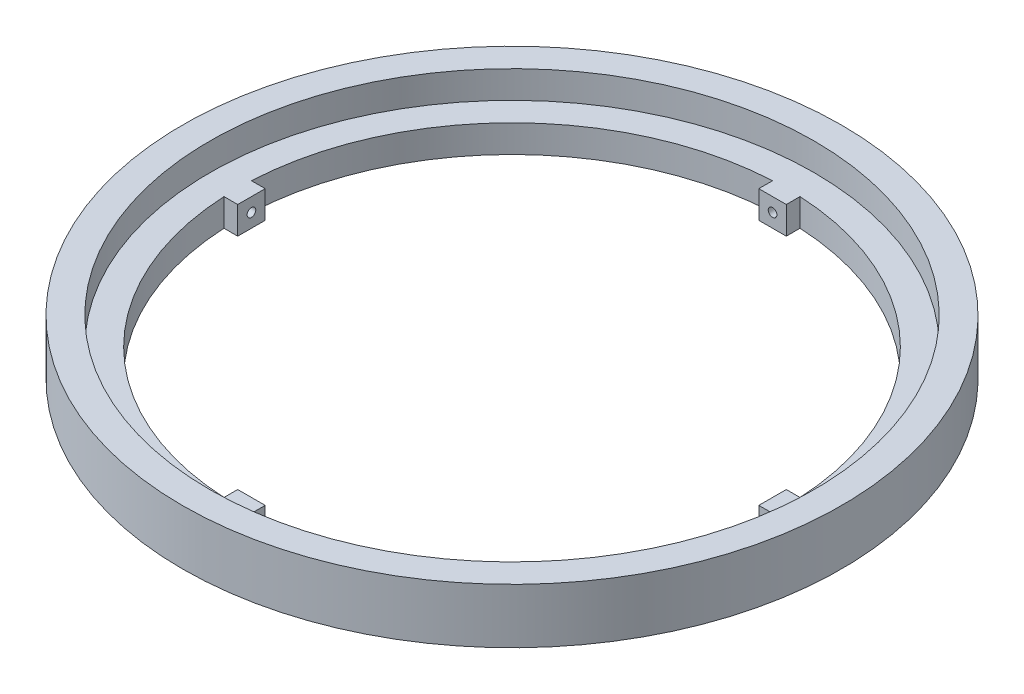
ISO-10303-21;
HEADER;
FILE_DESCRIPTION(('STEP AP214'),'2;1');
FILE_NAME('part.step','',(''),(''),'','','');
FILE_SCHEMA(('AUTOMOTIVE_DESIGN { 1 0 10303 214 1 1 1 1 }'));
ENDSEC;
DATA;
#1=APPLICATION_CONTEXT('core data for automotive mechanical design processes');
#2=APPLICATION_PROTOCOL_DEFINITION('international standard','automotive_design',2000,#1);
#3=PRODUCT_CONTEXT('',#1,'mechanical');
#4=PRODUCT('Part','Part','',(#3));
#5=PRODUCT_RELATED_PRODUCT_CATEGORY('part','',(#4));
#6=PRODUCT_DEFINITION_FORMATION('','',#4);
#7=PRODUCT_DEFINITION_CONTEXT('part definition',#1,'design');
#8=PRODUCT_DEFINITION('design','',#6,#7);
#9=PRODUCT_DEFINITION_SHAPE('','',#8);
#10=(LENGTH_UNIT() NAMED_UNIT(*) SI_UNIT(.MILLI.,.METRE.));
#11=(NAMED_UNIT(*) PLANE_ANGLE_UNIT() SI_UNIT($,.RADIAN.));
#12=(NAMED_UNIT(*) SI_UNIT($,.STERADIAN.) SOLID_ANGLE_UNIT());
#13=UNCERTAINTY_MEASURE_WITH_UNIT(LENGTH_MEASURE(1.E-05),#10,'distance_accuracy_value','');
#14=(GEOMETRIC_REPRESENTATION_CONTEXT(3) GLOBAL_UNCERTAINTY_ASSIGNED_CONTEXT((#13)) GLOBAL_UNIT_ASSIGNED_CONTEXT((#10,
#11,#12)) REPRESENTATION_CONTEXT('',''));
#15=CARTESIAN_POINT('',(0.,0.,0.));
#16=DIRECTION('',(0.,0.,1.));
#17=DIRECTION('',(1.,0.,0.));
#18=AXIS2_PLACEMENT_3D('',#15,#16,#17);
#19=CARTESIAN_POINT('',(0.,12.7,0.));
#20=DIRECTION('',(0.,-1.,0.));
#21=DIRECTION('',(0.,0.,-1.));
#22=AXIS2_PLACEMENT_3D('',#19,#20,#21);
#23=CYLINDRICAL_SURFACE('',#22,127.);
#24=CARTESIAN_POINT('',(0.,12.7,0.));
#25=DIRECTION('',(0.,1.,0.));
#26=DIRECTION('',(0.,0.,1.));
#27=AXIS2_PLACEMENT_3D('',#24,#25,#26);
#28=CIRCLE('',#27,127.);
#29=CARTESIAN_POINT('',(126.841150657032,12.7,-6.34999999999995));
#30=VERTEX_POINT('',#29);
#31=CARTESIAN_POINT('',(6.35,12.7,-126.841150657032));
#32=VERTEX_POINT('',#31);
#33=EDGE_CURVE('E328',#30,#32,#28,.T.);
#34=ORIENTED_EDGE('',*,*,#33,.T.);
#35=DIRECTION('',(0.,-1.,0.));
#36=VECTOR('',#35,1.);
#37=CARTESIAN_POINT('',(6.35,12.7,-126.841150657032));
#38=LINE('',#37,#36);
#39=CARTESIAN_POINT('',(6.35,0.,-126.841150657032));
#40=VERTEX_POINT('',#39);
#41=EDGE_CURVE('E58',#32,#40,#38,.T.);
#42=ORIENTED_EDGE('',*,*,#41,.T.);
#43=CARTESIAN_POINT('',(0.,0.,0.));
#44=DIRECTION('',(0.,1.,0.));
#45=DIRECTION('',(0.,0.,1.));
#46=AXIS2_PLACEMENT_3D('',#43,#44,#45);
#47=CIRCLE('',#46,127.);
#48=CARTESIAN_POINT('',(126.841150657032,0.,-6.34999999999995));
#49=VERTEX_POINT('',#48);
#50=EDGE_CURVE('E315',#49,#40,#47,.T.);
#51=ORIENTED_EDGE('',*,*,#50,.F.);
#52=DIRECTION('',(0.,-1.,0.));
#53=VECTOR('',#52,1.);
#54=CARTESIAN_POINT('',(126.841150657032,12.7,-6.34999999999995));
#55=LINE('',#54,#53);
#56=EDGE_CURVE('E214',#30,#49,#55,.T.);
#57=ORIENTED_EDGE('',*,*,#56,.F.);
#58=EDGE_LOOP('',(#34,#42,#51,#57));
#59=FACE_BOUND('',#58,.T.);
#60=ADVANCED_FACE('F35',(#59),#23,.F.);
#61=CARTESIAN_POINT('',(6.34999999999996,12.7,126.841150657032));
#62=VERTEX_POINT('',#61);
#63=CARTESIAN_POINT('',(126.841150657032,12.7,6.35000000000004));
#64=VERTEX_POINT('',#63);
#65=EDGE_CURVE('E275',#62,#64,#28,.T.);
#66=ORIENTED_EDGE('',*,*,#65,.T.);
#67=DIRECTION('',(0.,-1.,0.));
#68=VECTOR('',#67,1.);
#69=CARTESIAN_POINT('',(126.841150657032,12.7,6.35000000000005));
#70=LINE('',#69,#68);
#71=CARTESIAN_POINT('',(126.841150657032,0.,6.35000000000004));
#72=VERTEX_POINT('',#71);
#73=EDGE_CURVE('E212',#64,#72,#70,.T.);
#74=ORIENTED_EDGE('',*,*,#73,.T.);
#75=CARTESIAN_POINT('',(6.34999999999996,0.,126.841150657032));
#76=VERTEX_POINT('',#75);
#77=EDGE_CURVE('E279',#76,#72,#47,.T.);
#78=ORIENTED_EDGE('',*,*,#77,.F.);
#79=DIRECTION('',(0.,-1.,0.));
#80=VECTOR('',#79,1.);
#81=CARTESIAN_POINT('',(6.34999999999996,12.7,126.841150657032));
#82=LINE('',#81,#80);
#83=EDGE_CURVE('E242',#62,#76,#82,.T.);
#84=ORIENTED_EDGE('',*,*,#83,.F.);
#85=EDGE_LOOP('',(#66,#74,#78,#84));
#86=FACE_BOUND('',#85,.T.);
#87=ADVANCED_FACE('F313',(#86),#23,.F.);
#88=CARTESIAN_POINT('',(-126.841150657032,12.7,6.35));
#89=VERTEX_POINT('',#88);
#90=CARTESIAN_POINT('',(-6.35000000000003,12.7,126.841150657032));
#91=VERTEX_POINT('',#90);
#92=EDGE_CURVE('E272',#89,#91,#28,.T.);
#93=ORIENTED_EDGE('',*,*,#92,.T.);
#94=DIRECTION('',(0.,-1.,0.));
#95=VECTOR('',#94,1.);
#96=CARTESIAN_POINT('',(-6.35000000000004,12.7,126.841150657032));
#97=LINE('',#96,#95);
#98=CARTESIAN_POINT('',(-6.35000000000003,0.,126.841150657032));
#99=VERTEX_POINT('',#98);
#100=EDGE_CURVE('E240',#91,#99,#97,.T.);
#101=ORIENTED_EDGE('',*,*,#100,.T.);
#102=CARTESIAN_POINT('',(-126.841150657032,0.,6.35));
#103=VERTEX_POINT('',#102);
#104=EDGE_CURVE('E276',#103,#99,#47,.T.);
#105=ORIENTED_EDGE('',*,*,#104,.F.);
#106=DIRECTION('',(0.,-1.,0.));
#107=VECTOR('',#106,1.);
#108=CARTESIAN_POINT('',(-126.841150657032,12.7,6.35));
#109=LINE('',#108,#107);
#110=EDGE_CURVE('E268',#89,#103,#109,.T.);
#111=ORIENTED_EDGE('',*,*,#110,.F.);
#112=EDGE_LOOP('',(#93,#101,#105,#111));
#113=FACE_BOUND('',#112,.T.);
#114=ADVANCED_FACE('F327',(#113),#23,.F.);
#115=DIRECTION('',(0.,-1.,0.));
#116=VECTOR('',#115,1.);
#117=CARTESIAN_POINT('',(-6.35,12.7,-126.841150657032));
#118=LINE('',#117,#116);
#119=CARTESIAN_POINT('',(-6.35,12.7,-126.841150657032));
#120=VERTEX_POINT('',#119);
#121=CARTESIAN_POINT('',(-6.35,0.,-126.841150657032));
#122=VERTEX_POINT('',#121);
#123=EDGE_CURVE('E159',#120,#122,#118,.T.);
#124=ORIENTED_EDGE('',*,*,#123,.F.);
#125=CARTESIAN_POINT('',(-126.841150657032,12.7,-6.35));
#126=VERTEX_POINT('',#125);
#127=EDGE_CURVE('E175',#120,#126,#28,.T.);
#128=ORIENTED_EDGE('',*,*,#127,.T.);
#129=DIRECTION('',(0.,-1.,0.));
#130=VECTOR('',#129,1.);
#131=CARTESIAN_POINT('',(-126.841150657032,12.7,-6.35));
#132=LINE('',#131,#130);
#133=CARTESIAN_POINT('',(-126.841150657032,0.,-6.35));
#134=VERTEX_POINT('',#133);
#135=EDGE_CURVE('E266',#126,#134,#132,.T.);
#136=ORIENTED_EDGE('',*,*,#135,.T.);
#137=EDGE_CURVE('E50',#122,#134,#47,.T.);
#138=ORIENTED_EDGE('',*,*,#137,.F.);
#139=EDGE_LOOP('',(#124,#128,#136,#138));
#140=FACE_BOUND('',#139,.T.);
#141=ADVANCED_FACE('F317',(#140),#23,.F.);
#142=CARTESIAN_POINT('',(0.,25.4,0.));
#143=DIRECTION('',(0.,-1.,0.));
#144=DIRECTION('',(0.,0.,-1.));
#145=AXIS2_PLACEMENT_3D('',#142,#143,#144);
#146=CYLINDRICAL_SURFACE('',#145,139.7);
#147=CARTESIAN_POINT('',(0.,12.7,0.));
#148=DIRECTION('',(0.,1.,0.));
#149=DIRECTION('',(0.,0.,1.));
#150=AXIS2_PLACEMENT_3D('',#147,#148,#149);
#151=CIRCLE('',#150,139.7);
#152=CARTESIAN_POINT('',(0.,12.7,139.7));
#153=VERTEX_POINT('',#152);
#154=EDGE_CURVE('E11',#153,#153,#151,.T.);
#155=ORIENTED_EDGE('',*,*,#154,.F.);
#156=EDGE_LOOP('',(#155));
#157=FACE_BOUND('',#156,.T.);
#158=CARTESIAN_POINT('',(0.,25.4,0.));
#159=DIRECTION('',(0.,1.,0.));
#160=DIRECTION('',(0.,0.,1.));
#161=AXIS2_PLACEMENT_3D('',#158,#159,#160);
#162=CIRCLE('',#161,139.7);
#163=CARTESIAN_POINT('',(0.,25.4,139.7));
#164=VERTEX_POINT('',#163);
#165=EDGE_CURVE('E280',#164,#164,#162,.T.);
#166=ORIENTED_EDGE('',*,*,#165,.T.);
#167=EDGE_LOOP('',(#166));
#168=FACE_BOUND('',#167,.T.);
#169=ADVANCED_FACE('F37',(#157,#168),#146,.F.);
#170=CARTESIAN_POINT('',(0.,25.4,0.));
#171=DIRECTION('',(0.,-1.,0.));
#172=DIRECTION('',(0.,0.,-1.));
#173=AXIS2_PLACEMENT_3D('',#170,#171,#172);
#174=CYLINDRICAL_SURFACE('',#173,152.4);
#175=CARTESIAN_POINT('',(0.,25.4,0.));
#176=DIRECTION('',(0.,1.,0.));
#177=DIRECTION('',(0.,0.,1.));
#178=AXIS2_PLACEMENT_3D('',#175,#176,#177);
#179=CIRCLE('',#178,152.4);
#180=CARTESIAN_POINT('',(0.,25.4,152.4));
#181=VERTEX_POINT('',#180);
#182=EDGE_CURVE('E43',#181,#181,#179,.T.);
#183=ORIENTED_EDGE('',*,*,#182,.F.);
#184=EDGE_LOOP('',(#183));
#185=FACE_BOUND('',#184,.T.);
#186=CARTESIAN_POINT('',(0.,0.,0.));
#187=DIRECTION('',(0.,1.,0.));
#188=DIRECTION('',(0.,0.,1.));
#189=AXIS2_PLACEMENT_3D('',#186,#187,#188);
#190=CIRCLE('',#189,152.4);
#191=CARTESIAN_POINT('',(0.,0.,152.4));
#192=VERTEX_POINT('',#191);
#193=EDGE_CURVE('E274',#192,#192,#190,.T.);
#194=ORIENTED_EDGE('',*,*,#193,.T.);
#195=EDGE_LOOP('',(#194));
#196=FACE_BOUND('',#195,.T.);
#197=ADVANCED_FACE('F287',(#185,#196),#174,.T.);
#198=CARTESIAN_POINT('',(0.,25.4,0.));
#199=DIRECTION('',(0.,1.,0.));
#200=DIRECTION('',(0.,0.,1.));
#201=AXIS2_PLACEMENT_3D('',#198,#199,#200);
#202=PLANE('',#201);
#203=ORIENTED_EDGE('',*,*,#165,.F.);
#204=EDGE_LOOP('',(#203));
#205=FACE_BOUND('',#204,.T.);
#206=ORIENTED_EDGE('',*,*,#182,.T.);
#207=EDGE_LOOP('',(#206));
#208=FACE_BOUND('',#207,.T.);
#209=ADVANCED_FACE('F292',(#205,#208),#202,.T.);
#210=CARTESIAN_POINT('',(0.,0.,0.));
#211=DIRECTION('',(0.,1.,0.));
#212=DIRECTION('',(0.,0.,1.));
#213=AXIS2_PLACEMENT_3D('',#210,#211,#212);
#214=PLANE('',#213);
#215=ORIENTED_EDGE('',*,*,#193,.F.);
#216=EDGE_LOOP('',(#215));
#217=FACE_BOUND('',#216,.T.);
#218=ORIENTED_EDGE('',*,*,#104,.T.);
#219=DIRECTION('',(0.,0.,1.));
#220=VECTOR('',#219,1.);
#221=CARTESIAN_POINT('',(-6.35,0.,0.));
#222=LINE('',#221,#220);
#223=CARTESIAN_POINT('',(-6.35000000000003,0.,120.491150657032));
#224=VERTEX_POINT('',#223);
#225=EDGE_CURVE('E222',#224,#99,#222,.T.);
#226=ORIENTED_EDGE('',*,*,#225,.F.);
#227=DIRECTION('',(-1.,0.,0.));
#228=VECTOR('',#227,1.);
#229=CARTESIAN_POINT('',(0.,0.,120.491150657032));
#230=LINE('',#229,#228);
#231=CARTESIAN_POINT('',(6.34999999999997,0.,120.491150657032));
#232=VERTEX_POINT('',#231);
#233=EDGE_CURVE('E211',#232,#224,#230,.T.);
#234=ORIENTED_EDGE('',*,*,#233,.F.);
#235=DIRECTION('',(0.,0.,1.));
#236=VECTOR('',#235,1.);
#237=CARTESIAN_POINT('',(6.35,0.,0.));
#238=LINE('',#237,#236);
#239=EDGE_CURVE('E231',#232,#76,#238,.T.);
#240=ORIENTED_EDGE('',*,*,#239,.T.);
#241=ORIENTED_EDGE('',*,*,#77,.T.);
#242=DIRECTION('',(1.,0.,0.));
#243=VECTOR('',#242,1.);
#244=CARTESIAN_POINT('',(0.,0.,6.35000000000005));
#245=LINE('',#244,#243);
#246=CARTESIAN_POINT('',(120.491150657032,0.,6.35000000000005));
#247=VERTEX_POINT('',#246);
#248=EDGE_CURVE('E194',#247,#72,#245,.T.);
#249=ORIENTED_EDGE('',*,*,#248,.F.);
#250=DIRECTION('',(0.,0.,1.));
#251=VECTOR('',#250,1.);
#252=CARTESIAN_POINT('',(120.491150657032,0.,0.));
#253=LINE('',#252,#251);
#254=CARTESIAN_POINT('',(120.491150657032,0.,-6.34999999999995));
#255=VERTEX_POINT('',#254);
#256=EDGE_CURVE('E187',#255,#247,#253,.T.);
#257=ORIENTED_EDGE('',*,*,#256,.F.);
#258=DIRECTION('',(1.,0.,0.));
#259=VECTOR('',#258,1.);
#260=CARTESIAN_POINT('',(0.,0.,-6.34999999999995));
#261=LINE('',#260,#259);
#262=EDGE_CURVE('E203',#255,#49,#261,.T.);
#263=ORIENTED_EDGE('',*,*,#262,.T.);
#264=ORIENTED_EDGE('',*,*,#50,.T.);
#265=DIRECTION('',(0.,0.,-1.));
#266=VECTOR('',#265,1.);
#267=CARTESIAN_POINT('',(6.35,0.,0.));
#268=LINE('',#267,#266);
#269=CARTESIAN_POINT('',(6.35,0.,-120.491150657032));
#270=VERTEX_POINT('',#269);
#271=EDGE_CURVE('E170',#270,#40,#268,.T.);
#272=ORIENTED_EDGE('',*,*,#271,.F.);
#273=DIRECTION('',(1.,0.,0.));
#274=VECTOR('',#273,1.);
#275=CARTESIAN_POINT('',(0.,0.,-120.491150657032));
#276=LINE('',#275,#274);
#277=CARTESIAN_POINT('',(-6.35,0.,-120.491150657032));
#278=VERTEX_POINT('',#277);
#279=EDGE_CURVE('E180',#278,#270,#276,.T.);
#280=ORIENTED_EDGE('',*,*,#279,.F.);
#281=DIRECTION('',(0.,0.,-1.));
#282=VECTOR('',#281,1.);
#283=CARTESIAN_POINT('',(-6.35,0.,0.));
#284=LINE('',#283,#282);
#285=EDGE_CURVE('E155',#278,#122,#284,.T.);
#286=ORIENTED_EDGE('',*,*,#285,.T.);
#287=ORIENTED_EDGE('',*,*,#137,.T.);
#288=DIRECTION('',(-1.,0.,0.));
#289=VECTOR('',#288,1.);
#290=CARTESIAN_POINT('',(0.,0.,-6.35));
#291=LINE('',#290,#289);
#292=CARTESIAN_POINT('',(-120.491150657032,0.,-6.35));
#293=VERTEX_POINT('',#292);
#294=EDGE_CURVE('E250',#293,#134,#291,.T.);
#295=ORIENTED_EDGE('',*,*,#294,.F.);
#296=DIRECTION('',(0.,0.,-1.));
#297=VECTOR('',#296,1.);
#298=CARTESIAN_POINT('',(-120.491150657032,0.,0.));
#299=LINE('',#298,#297);
#300=CARTESIAN_POINT('',(-120.491150657032,0.,6.35));
#301=VERTEX_POINT('',#300);
#302=EDGE_CURVE('E239',#301,#293,#299,.T.);
#303=ORIENTED_EDGE('',*,*,#302,.F.);
#304=DIRECTION('',(-1.,0.,0.));
#305=VECTOR('',#304,1.);
#306=CARTESIAN_POINT('',(0.,0.,6.35));
#307=LINE('',#306,#305);
#308=EDGE_CURVE('E258',#301,#103,#307,.T.);
#309=ORIENTED_EDGE('',*,*,#308,.T.);
#310=EDGE_LOOP('',(#218,#226,#234,#240,#241,#249,#257,#263,#264,#272,#280,#286,#287,#295,#303,#309));
#311=FACE_BOUND('',#310,.T.);
#312=ADVANCED_FACE('F289',(#217,#311),#214,.F.);
#313=CARTESIAN_POINT('',(0.,12.7,0.));
#314=DIRECTION('',(0.,1.,0.));
#315=DIRECTION('',(0.,0.,1.));
#316=AXIS2_PLACEMENT_3D('',#313,#314,#315);
#317=PLANE('',#316);
#318=ORIENTED_EDGE('',*,*,#92,.F.);
#319=DIRECTION('',(-1.,0.,0.));
#320=VECTOR('',#319,1.);
#321=CARTESIAN_POINT('',(0.,12.7,6.35));
#322=LINE('',#321,#320);
#323=CARTESIAN_POINT('',(-120.491150657032,12.7,6.35));
#324=VERTEX_POINT('',#323);
#325=EDGE_CURVE('E249',#324,#89,#322,.T.);
#326=ORIENTED_EDGE('',*,*,#325,.F.);
#327=DIRECTION('',(0.,0.,-1.));
#328=VECTOR('',#327,1.);
#329=CARTESIAN_POINT('',(-120.491150657032,12.7,0.));
#330=LINE('',#329,#328);
#331=CARTESIAN_POINT('',(-120.491150657032,12.7,-6.35));
#332=VERTEX_POINT('',#331);
#333=EDGE_CURVE('E246',#324,#332,#330,.T.);
#334=ORIENTED_EDGE('',*,*,#333,.T.);
#335=DIRECTION('',(-1.,0.,0.));
#336=VECTOR('',#335,1.);
#337=CARTESIAN_POINT('',(0.,12.7,-6.35));
#338=LINE('',#337,#336);
#339=EDGE_CURVE('E253',#332,#126,#338,.T.);
#340=ORIENTED_EDGE('',*,*,#339,.T.);
#341=ORIENTED_EDGE('',*,*,#127,.F.);
#342=DIRECTION('',(0.,0.,-1.));
#343=VECTOR('',#342,1.);
#344=CARTESIAN_POINT('',(-6.35,12.7,0.));
#345=LINE('',#344,#343);
#346=CARTESIAN_POINT('',(-6.35,12.7,-120.491150657032));
#347=VERTEX_POINT('',#346);
#348=EDGE_CURVE('E153',#347,#120,#345,.T.);
#349=ORIENTED_EDGE('',*,*,#348,.F.);
#350=DIRECTION('',(1.,0.,0.));
#351=VECTOR('',#350,1.);
#352=CARTESIAN_POINT('',(0.,12.7,-120.491150657032));
#353=LINE('',#352,#351);
#354=CARTESIAN_POINT('',(6.35,12.7,-120.491150657032));
#355=VERTEX_POINT('',#354);
#356=EDGE_CURVE('E164',#347,#355,#353,.T.);
#357=ORIENTED_EDGE('',*,*,#356,.T.);
#358=DIRECTION('',(0.,0.,-1.));
#359=VECTOR('',#358,1.);
#360=CARTESIAN_POINT('',(6.35,12.7,0.));
#361=LINE('',#360,#359);
#362=EDGE_CURVE('E160',#355,#32,#361,.T.);
#363=ORIENTED_EDGE('',*,*,#362,.T.);
#364=ORIENTED_EDGE('',*,*,#33,.F.);
#365=DIRECTION('',(1.,0.,0.));
#366=VECTOR('',#365,1.);
#367=CARTESIAN_POINT('',(0.,12.7,-6.34999999999995));
#368=LINE('',#367,#366);
#369=CARTESIAN_POINT('',(120.491150657032,12.7,-6.34999999999995));
#370=VERTEX_POINT('',#369);
#371=EDGE_CURVE('E193',#370,#30,#368,.T.);
#372=ORIENTED_EDGE('',*,*,#371,.F.);
#373=DIRECTION('',(0.,0.,1.));
#374=VECTOR('',#373,1.);
#375=CARTESIAN_POINT('',(120.491150657032,12.7,0.));
#376=LINE('',#375,#374);
#377=CARTESIAN_POINT('',(120.491150657032,12.7,6.35000000000005));
#378=VERTEX_POINT('',#377);
#379=EDGE_CURVE('E190',#370,#378,#376,.T.);
#380=ORIENTED_EDGE('',*,*,#379,.T.);
#381=DIRECTION('',(1.,0.,0.));
#382=VECTOR('',#381,1.);
#383=CARTESIAN_POINT('',(0.,12.7,6.35000000000005));
#384=LINE('',#383,#382);
#385=EDGE_CURVE('E197',#378,#64,#384,.T.);
#386=ORIENTED_EDGE('',*,*,#385,.T.);
#387=ORIENTED_EDGE('',*,*,#65,.F.);
#388=DIRECTION('',(0.,0.,1.));
#389=VECTOR('',#388,1.);
#390=CARTESIAN_POINT('',(6.35,12.7,0.));
#391=LINE('',#390,#389);
#392=CARTESIAN_POINT('',(6.34999999999997,12.7,120.491150657032));
#393=VERTEX_POINT('',#392);
#394=EDGE_CURVE('E221',#393,#62,#391,.T.);
#395=ORIENTED_EDGE('',*,*,#394,.F.);
#396=DIRECTION('',(-1.,0.,0.));
#397=VECTOR('',#396,1.);
#398=CARTESIAN_POINT('',(0.,12.7,120.491150657032));
#399=LINE('',#398,#397);
#400=CARTESIAN_POINT('',(-6.35000000000003,12.7,120.491150657032));
#401=VERTEX_POINT('',#400);
#402=EDGE_CURVE('E218',#393,#401,#399,.T.);
#403=ORIENTED_EDGE('',*,*,#402,.T.);
#404=DIRECTION('',(0.,0.,1.));
#405=VECTOR('',#404,1.);
#406=CARTESIAN_POINT('',(-6.35,12.7,0.));
#407=LINE('',#406,#405);
#408=EDGE_CURVE('E225',#401,#91,#407,.T.);
#409=ORIENTED_EDGE('',*,*,#408,.T.);
#410=EDGE_LOOP('',(#318,#326,#334,#340,#341,#349,#357,#363,#364,#372,#380,#386,#387,#395,#403,#409));
#411=FACE_BOUND('',#410,.T.);
#412=ORIENTED_EDGE('',*,*,#154,.T.);
#413=EDGE_LOOP('',(#412));
#414=FACE_BOUND('',#413,.T.);
#415=ADVANCED_FACE('F172',(#411,#414),#317,.T.);
#416=CARTESIAN_POINT('',(-120.491150657032,12.7,0.));
#417=DIRECTION('',(-1.,0.,0.));
#418=DIRECTION('',(0.,0.,1.));
#419=AXIS2_PLACEMENT_3D('',#416,#417,#418);
#420=PLANE('',#419);
#421=CARTESIAN_POINT('',(-120.491150657032,6.35,0.));
#422=DIRECTION('',(1.,0.,0.));
#423=DIRECTION('',(0.,0.,-1.));
#424=AXIS2_PLACEMENT_3D('',#421,#422,#423);
#425=CIRCLE('',#424,2.);
#426=CARTESIAN_POINT('',(-120.491150657032,6.35,-2.));
#427=VERTEX_POINT('',#426);
#428=EDGE_CURVE('E557',#427,#427,#425,.T.);
#429=ORIENTED_EDGE('',*,*,#428,.F.);
#430=EDGE_LOOP('',(#429));
#431=FACE_BOUND('',#430,.T.);
#432=ORIENTED_EDGE('',*,*,#302,.T.);
#433=DIRECTION('',(0.,-1.,0.));
#434=VECTOR('',#433,1.);
#435=CARTESIAN_POINT('',(-120.491150657032,12.7,-6.35));
#436=LINE('',#435,#434);
#437=EDGE_CURVE('E263',#332,#293,#436,.T.);
#438=ORIENTED_EDGE('',*,*,#437,.F.);
#439=ORIENTED_EDGE('',*,*,#333,.F.);
#440=DIRECTION('',(0.,-1.,0.));
#441=VECTOR('',#440,1.);
#442=CARTESIAN_POINT('',(-120.491150657032,12.7,6.35));
#443=LINE('',#442,#441);
#444=EDGE_CURVE('E255',#324,#301,#443,.T.);
#445=ORIENTED_EDGE('',*,*,#444,.T.);
#446=EDGE_LOOP('',(#432,#438,#439,#445));
#447=FACE_BOUND('',#446,.T.);
#448=ADVANCED_FACE('F323',(#431,#447),#420,.F.);
#449=CARTESIAN_POINT('',(0.,12.7,-6.35));
#450=DIRECTION('',(0.,0.,1.));
#451=DIRECTION('',(1.,0.,0.));
#452=AXIS2_PLACEMENT_3D('',#449,#450,#451);
#453=PLANE('',#452);
#454=ORIENTED_EDGE('',*,*,#294,.T.);
#455=ORIENTED_EDGE('',*,*,#135,.F.);
#456=ORIENTED_EDGE('',*,*,#339,.F.);
#457=ORIENTED_EDGE('',*,*,#437,.T.);
#458=EDGE_LOOP('',(#454,#455,#456,#457));
#459=FACE_BOUND('',#458,.T.);
#460=ADVANCED_FACE('F319',(#459),#453,.F.);
#461=CARTESIAN_POINT('',(0.,12.7,6.35));
#462=DIRECTION('',(0.,0.,1.));
#463=DIRECTION('',(1.,0.,0.));
#464=AXIS2_PLACEMENT_3D('',#461,#462,#463);
#465=PLANE('',#464);
#466=ORIENTED_EDGE('',*,*,#308,.F.);
#467=ORIENTED_EDGE('',*,*,#444,.F.);
#468=ORIENTED_EDGE('',*,*,#325,.T.);
#469=ORIENTED_EDGE('',*,*,#110,.T.);
#470=EDGE_LOOP('',(#466,#467,#468,#469));
#471=FACE_BOUND('',#470,.T.);
#472=ADVANCED_FACE('F325',(#471),#465,.T.);
#473=CARTESIAN_POINT('',(0.,12.7,120.491150657032));
#474=DIRECTION('',(0.,0.,1.));
#475=DIRECTION('',(1.,0.,0.));
#476=AXIS2_PLACEMENT_3D('',#473,#474,#475);
#477=PLANE('',#476);
#478=CARTESIAN_POINT('',(4.17223157062812E-13,6.35,120.491150657032));
#479=DIRECTION('',(0.,0.,-1.));
#480=DIRECTION('',(-1.,0.,0.));
#481=AXIS2_PLACEMENT_3D('',#478,#479,#480);
#482=CIRCLE('',#481,2.);
#483=CARTESIAN_POINT('',(-1.99999999999958,6.35,120.491150657032));
#484=VERTEX_POINT('',#483);
#485=EDGE_CURVE('E560',#484,#484,#482,.T.);
#486=ORIENTED_EDGE('',*,*,#485,.F.);
#487=EDGE_LOOP('',(#486));
#488=FACE_BOUND('',#487,.T.);
#489=ORIENTED_EDGE('',*,*,#233,.T.);
#490=DIRECTION('',(0.,-1.,0.));
#491=VECTOR('',#490,1.);
#492=CARTESIAN_POINT('',(-6.35000000000003,12.7,120.491150657032));
#493=LINE('',#492,#491);
#494=EDGE_CURVE('E236',#401,#224,#493,.T.);
#495=ORIENTED_EDGE('',*,*,#494,.F.);
#496=ORIENTED_EDGE('',*,*,#402,.F.);
#497=DIRECTION('',(0.,-1.,0.));
#498=VECTOR('',#497,1.);
#499=CARTESIAN_POINT('',(6.34999999999997,12.7,120.491150657032));
#500=LINE('',#499,#498);
#501=EDGE_CURVE('E228',#393,#232,#500,.T.);
#502=ORIENTED_EDGE('',*,*,#501,.T.);
#503=EDGE_LOOP('',(#489,#495,#496,#502));
#504=FACE_BOUND('',#503,.T.);
#505=ADVANCED_FACE('F305',(#488,#504),#477,.F.);
#506=CARTESIAN_POINT('',(-6.35,12.7,0.));
#507=DIRECTION('',(1.,0.,0.));
#508=DIRECTION('',(0.,0.,-1.));
#509=AXIS2_PLACEMENT_3D('',#506,#507,#508);
#510=PLANE('',#509);
#511=ORIENTED_EDGE('',*,*,#225,.T.);
#512=ORIENTED_EDGE('',*,*,#100,.F.);
#513=ORIENTED_EDGE('',*,*,#408,.F.);
#514=ORIENTED_EDGE('',*,*,#494,.T.);
#515=EDGE_LOOP('',(#511,#512,#513,#514));
#516=FACE_BOUND('',#515,.T.);
#517=ADVANCED_FACE('F301',(#516),#510,.F.);
#518=CARTESIAN_POINT('',(6.35,12.7,0.));
#519=DIRECTION('',(1.,0.,0.));
#520=DIRECTION('',(0.,0.,-1.));
#521=AXIS2_PLACEMENT_3D('',#518,#519,#520);
#522=PLANE('',#521);
#523=ORIENTED_EDGE('',*,*,#239,.F.);
#524=ORIENTED_EDGE('',*,*,#501,.F.);
#525=ORIENTED_EDGE('',*,*,#394,.T.);
#526=ORIENTED_EDGE('',*,*,#83,.T.);
#527=EDGE_LOOP('',(#523,#524,#525,#526));
#528=FACE_BOUND('',#527,.T.);
#529=ADVANCED_FACE('F309',(#528),#522,.T.);
#530=CARTESIAN_POINT('',(120.491150657032,12.7,0.));
#531=DIRECTION('',(1.,0.,0.));
#532=DIRECTION('',(0.,0.,-1.));
#533=AXIS2_PLACEMENT_3D('',#530,#531,#532);
#534=PLANE('',#533);
#535=CARTESIAN_POINT('',(120.491150657032,6.35,0.));
#536=DIRECTION('',(-1.,0.,0.));
#537=DIRECTION('',(0.,0.,1.));
#538=AXIS2_PLACEMENT_3D('',#535,#536,#537);
#539=CIRCLE('',#538,2.);
#540=CARTESIAN_POINT('',(120.491150657032,6.35,2.));
#541=VERTEX_POINT('',#540);
#542=EDGE_CURVE('E569',#541,#541,#539,.T.);
#543=ORIENTED_EDGE('',*,*,#542,.F.);
#544=EDGE_LOOP('',(#543));
#545=FACE_BOUND('',#544,.T.);
#546=ORIENTED_EDGE('',*,*,#256,.T.);
#547=DIRECTION('',(0.,-1.,0.));
#548=VECTOR('',#547,1.);
#549=CARTESIAN_POINT('',(120.491150657032,12.7,6.35000000000005));
#550=LINE('',#549,#548);
#551=EDGE_CURVE('E208',#378,#247,#550,.T.);
#552=ORIENTED_EDGE('',*,*,#551,.F.);
#553=ORIENTED_EDGE('',*,*,#379,.F.);
#554=DIRECTION('',(0.,-1.,0.));
#555=VECTOR('',#554,1.);
#556=CARTESIAN_POINT('',(120.491150657032,12.7,-6.34999999999995));
#557=LINE('',#556,#555);
#558=EDGE_CURVE('E200',#370,#255,#557,.T.);
#559=ORIENTED_EDGE('',*,*,#558,.T.);
#560=EDGE_LOOP('',(#546,#552,#553,#559));
#561=FACE_BOUND('',#560,.T.);
#562=ADVANCED_FACE('F447',(#545,#561),#534,.F.);
#563=CARTESIAN_POINT('',(0.,12.7,6.35000000000005));
#564=DIRECTION('',(0.,0.,-1.));
#565=DIRECTION('',(-1.,0.,0.));
#566=AXIS2_PLACEMENT_3D('',#563,#564,#565);
#567=PLANE('',#566);
#568=ORIENTED_EDGE('',*,*,#248,.T.);
#569=ORIENTED_EDGE('',*,*,#73,.F.);
#570=ORIENTED_EDGE('',*,*,#385,.F.);
#571=ORIENTED_EDGE('',*,*,#551,.T.);
#572=EDGE_LOOP('',(#568,#569,#570,#571));
#573=FACE_BOUND('',#572,.T.);
#574=ADVANCED_FACE('F454',(#573),#567,.F.);
#575=CARTESIAN_POINT('',(0.,12.7,-6.34999999999995));
#576=DIRECTION('',(0.,0.,-1.));
#577=DIRECTION('',(-1.,0.,0.));
#578=AXIS2_PLACEMENT_3D('',#575,#576,#577);
#579=PLANE('',#578);
#580=ORIENTED_EDGE('',*,*,#262,.F.);
#581=ORIENTED_EDGE('',*,*,#558,.F.);
#582=ORIENTED_EDGE('',*,*,#371,.T.);
#583=ORIENTED_EDGE('',*,*,#56,.T.);
#584=EDGE_LOOP('',(#580,#581,#582,#583));
#585=FACE_BOUND('',#584,.T.);
#586=ADVANCED_FACE('F341',(#585),#579,.T.);
#587=CARTESIAN_POINT('',(0.,12.7,-120.491150657032));
#588=DIRECTION('',(0.,0.,-1.));
#589=DIRECTION('',(-1.,0.,0.));
#590=AXIS2_PLACEMENT_3D('',#587,#588,#589);
#591=PLANE('',#590);
#592=CARTESIAN_POINT('',(-1.25860836509234E-12,6.35,-120.491150657032));
#593=DIRECTION('',(0.,0.,1.));
#594=DIRECTION('',(1.,0.,0.));
#595=AXIS2_PLACEMENT_3D('',#592,#593,#594);
#596=CIRCLE('',#595,2.);
#597=CARTESIAN_POINT('',(1.99999999999874,6.35,-120.491150657033));
#598=VERTEX_POINT('',#597);
#599=EDGE_CURVE('E563',#598,#598,#596,.T.);
#600=ORIENTED_EDGE('',*,*,#599,.F.);
#601=EDGE_LOOP('',(#600));
#602=FACE_BOUND('',#601,.T.);
#603=ORIENTED_EDGE('',*,*,#279,.T.);
#604=DIRECTION('',(0.,-1.,0.));
#605=VECTOR('',#604,1.);
#606=CARTESIAN_POINT('',(6.35,12.7,-120.491150657032));
#607=LINE('',#606,#605);
#608=EDGE_CURVE('E167',#355,#270,#607,.T.);
#609=ORIENTED_EDGE('',*,*,#608,.F.);
#610=ORIENTED_EDGE('',*,*,#356,.F.);
#611=DIRECTION('',(0.,-1.,0.));
#612=VECTOR('',#611,1.);
#613=CARTESIAN_POINT('',(-6.35,12.7,-120.491150657032));
#614=LINE('',#613,#612);
#615=EDGE_CURVE('E149',#347,#278,#614,.T.);
#616=ORIENTED_EDGE('',*,*,#615,.T.);
#617=EDGE_LOOP('',(#603,#609,#610,#616));
#618=FACE_BOUND('',#617,.T.);
#619=ADVANCED_FACE('F165',(#602,#618),#591,.F.);
#620=CARTESIAN_POINT('',(6.35,12.7,0.));
#621=DIRECTION('',(-1.,0.,0.));
#622=DIRECTION('',(0.,0.,1.));
#623=AXIS2_PLACEMENT_3D('',#620,#621,#622);
#624=PLANE('',#623);
#625=ORIENTED_EDGE('',*,*,#271,.T.);
#626=ORIENTED_EDGE('',*,*,#41,.F.);
#627=ORIENTED_EDGE('',*,*,#362,.F.);
#628=ORIENTED_EDGE('',*,*,#608,.T.);
#629=EDGE_LOOP('',(#625,#626,#627,#628));
#630=FACE_BOUND('',#629,.T.);
#631=ADVANCED_FACE('F332',(#630),#624,.F.);
#632=CARTESIAN_POINT('',(-6.35,12.7,0.));
#633=DIRECTION('',(-1.,0.,0.));
#634=DIRECTION('',(0.,0.,1.));
#635=AXIS2_PLACEMENT_3D('',#632,#633,#634);
#636=PLANE('',#635);
#637=ORIENTED_EDGE('',*,*,#285,.F.);
#638=ORIENTED_EDGE('',*,*,#615,.F.);
#639=ORIENTED_EDGE('',*,*,#348,.T.);
#640=ORIENTED_EDGE('',*,*,#123,.T.);
#641=EDGE_LOOP('',(#637,#638,#639,#640));
#642=FACE_BOUND('',#641,.T.);
#643=ADVANCED_FACE('F151',(#642),#636,.T.);
#644=CARTESIAN_POINT('',(-145.891150657032,6.35,0.));
#645=DIRECTION('',(1.,0.,0.));
#646=DIRECTION('',(0.,0.,-1.));
#647=AXIS2_PLACEMENT_3D('',#644,#645,#646);
#648=CYLINDRICAL_SURFACE('',#647,2.);
#649=CARTESIAN_POINT('',(-145.891150657032,6.35,0.));
#650=DIRECTION('',(1.,0.,0.));
#651=DIRECTION('',(0.,0.,-1.));
#652=AXIS2_PLACEMENT_3D('',#649,#650,#651);
#653=CIRCLE('',#652,2.);
#654=CARTESIAN_POINT('',(-145.891150657032,6.35,-2.));
#655=VERTEX_POINT('',#654);
#656=EDGE_CURVE('E182',#655,#655,#653,.T.);
#657=ORIENTED_EDGE('',*,*,#656,.F.);
#658=EDGE_LOOP('',(#657));
#659=FACE_BOUND('',#658,.T.);
#660=ORIENTED_EDGE('',*,*,#428,.T.);
#661=EDGE_LOOP('',(#660));
#662=FACE_BOUND('',#661,.T.);
#663=ADVANCED_FACE('F339',(#659,#662),#648,.F.);
#664=CARTESIAN_POINT('',(-145.891150657032,0.,0.));
#665=DIRECTION('',(1.,0.,0.));
#666=DIRECTION('',(0.,0.,-1.));
#667=AXIS2_PLACEMENT_3D('',#664,#665,#666);
#668=PLANE('',#667);
#669=ORIENTED_EDGE('',*,*,#656,.T.);
#670=EDGE_LOOP('',(#669));
#671=FACE_BOUND('',#670,.T.);
#672=ADVANCED_FACE('F485',(#671),#668,.T.);
#673=CARTESIAN_POINT('',(-1.52465924311219E-12,6.35,-145.891150657032));
#674=DIRECTION('',(0.,0.,1.));
#675=DIRECTION('',(1.,0.,0.));
#676=AXIS2_PLACEMENT_3D('',#673,#674,#675);
#677=CYLINDRICAL_SURFACE('',#676,2.);
#678=CARTESIAN_POINT('',(-1.52465924311219E-12,6.35,-145.891150657032));
#679=DIRECTION('',(0.,0.,1.));
#680=DIRECTION('',(1.,0.,0.));
#681=AXIS2_PLACEMENT_3D('',#678,#679,#680);
#682=CIRCLE('',#681,2.);
#683=CARTESIAN_POINT('',(1.99999999999848,6.35,-145.891150657033));
#684=VERTEX_POINT('',#683);
#685=EDGE_CURVE('E566',#684,#684,#682,.T.);
#686=ORIENTED_EDGE('',*,*,#685,.F.);
#687=EDGE_LOOP('',(#686));
#688=FACE_BOUND('',#687,.T.);
#689=ORIENTED_EDGE('',*,*,#599,.T.);
#690=EDGE_LOOP('',(#689));
#691=FACE_BOUND('',#690,.T.);
#692=ADVANCED_FACE('F479',(#688,#691),#677,.F.);
#693=CARTESIAN_POINT('',(-1.52812869006414E-12,0.,-145.891150657032));
#694=DIRECTION('',(0.,0.,1.));
#695=DIRECTION('',(1.,0.,0.));
#696=AXIS2_PLACEMENT_3D('',#693,#694,#695);
#697=PLANE('',#696);
#698=ORIENTED_EDGE('',*,*,#685,.T.);
#699=EDGE_LOOP('',(#698));
#700=FACE_BOUND('',#699,.T.);
#701=ADVANCED_FACE('F484',(#700),#697,.T.);
#702=CARTESIAN_POINT('',(145.891150657032,6.35,0.));
#703=DIRECTION('',(-1.,0.,0.));
#704=DIRECTION('',(0.,0.,1.));
#705=AXIS2_PLACEMENT_3D('',#702,#703,#704);
#706=CYLINDRICAL_SURFACE('',#705,2.);
#707=CARTESIAN_POINT('',(145.891150657032,6.35,0.));
#708=DIRECTION('',(-1.,0.,0.));
#709=DIRECTION('',(0.,0.,1.));
#710=AXIS2_PLACEMENT_3D('',#707,#708,#709);
#711=CIRCLE('',#710,2.);
#712=CARTESIAN_POINT('',(145.891150657032,6.35,2.));
#713=VERTEX_POINT('',#712);
#714=EDGE_CURVE('E572',#713,#713,#711,.T.);
#715=ORIENTED_EDGE('',*,*,#714,.F.);
#716=EDGE_LOOP('',(#715));
#717=FACE_BOUND('',#716,.T.);
#718=ORIENTED_EDGE('',*,*,#542,.T.);
#719=EDGE_LOOP('',(#718));
#720=FACE_BOUND('',#719,.T.);
#721=ADVANCED_FACE('F498',(#717,#720),#706,.F.);
#722=CARTESIAN_POINT('',(145.891150657032,0.,0.));
#723=DIRECTION('',(-1.,0.,0.));
#724=DIRECTION('',(0.,0.,1.));
#725=AXIS2_PLACEMENT_3D('',#722,#723,#724);
#726=PLANE('',#725);
#727=ORIENTED_EDGE('',*,*,#714,.T.);
#728=EDGE_LOOP('',(#727));
#729=FACE_BOUND('',#728,.T.);
#730=ADVANCED_FACE('F508',(#729),#726,.T.);
#731=CARTESIAN_POINT('',(5.05906783069427E-13,6.35,145.891150657032));
#732=DIRECTION('',(0.,0.,-1.));
#733=DIRECTION('',(-1.,0.,0.));
#734=AXIS2_PLACEMENT_3D('',#731,#732,#733);
#735=CYLINDRICAL_SURFACE('',#734,2.);
#736=CARTESIAN_POINT('',(5.05906783069427E-13,6.35,145.891150657032));
#737=DIRECTION('',(0.,0.,-1.));
#738=DIRECTION('',(-1.,0.,0.));
#739=AXIS2_PLACEMENT_3D('',#736,#737,#738);
#740=CIRCLE('',#739,2.);
#741=CARTESIAN_POINT('',(-1.99999999999949,6.35,145.891150657032));
#742=VERTEX_POINT('',#741);
#743=EDGE_CURVE('E558',#742,#742,#740,.T.);
#744=ORIENTED_EDGE('',*,*,#743,.F.);
#745=EDGE_LOOP('',(#744));
#746=FACE_BOUND('',#745,.T.);
#747=ORIENTED_EDGE('',*,*,#485,.T.);
#748=EDGE_LOOP('',(#747));
#749=FACE_BOUND('',#748,.T.);
#750=ADVANCED_FACE('F519',(#746,#749),#735,.F.);
#751=CARTESIAN_POINT('',(5.09376230021381E-13,0.,145.891150657032));
#752=DIRECTION('',(0.,0.,-1.));
#753=DIRECTION('',(-1.,0.,0.));
#754=AXIS2_PLACEMENT_3D('',#751,#752,#753);
#755=PLANE('',#754);
#756=ORIENTED_EDGE('',*,*,#743,.T.);
#757=EDGE_LOOP('',(#756));
#758=FACE_BOUND('',#757,.T.);
#759=ADVANCED_FACE('F529',(#758),#755,.T.);
#760=CLOSED_SHELL('',(#60,#87,#114,#141,#169,#197,#209,#312,#415,#448,#460,#472,#505,#517,#529,
#562,#574,#586,#619,#631,#643,#663,#672,#692,#701,#721,#730,#750,#759));
#761=MANIFOLD_SOLID_BREP('B2',#760);
#762=ADVANCED_BREP_SHAPE_REPRESENTATION('',(#18,#761),#14);
#763=SHAPE_DEFINITION_REPRESENTATION(#9,#762);
ENDSEC;
END-ISO-10303-21;
